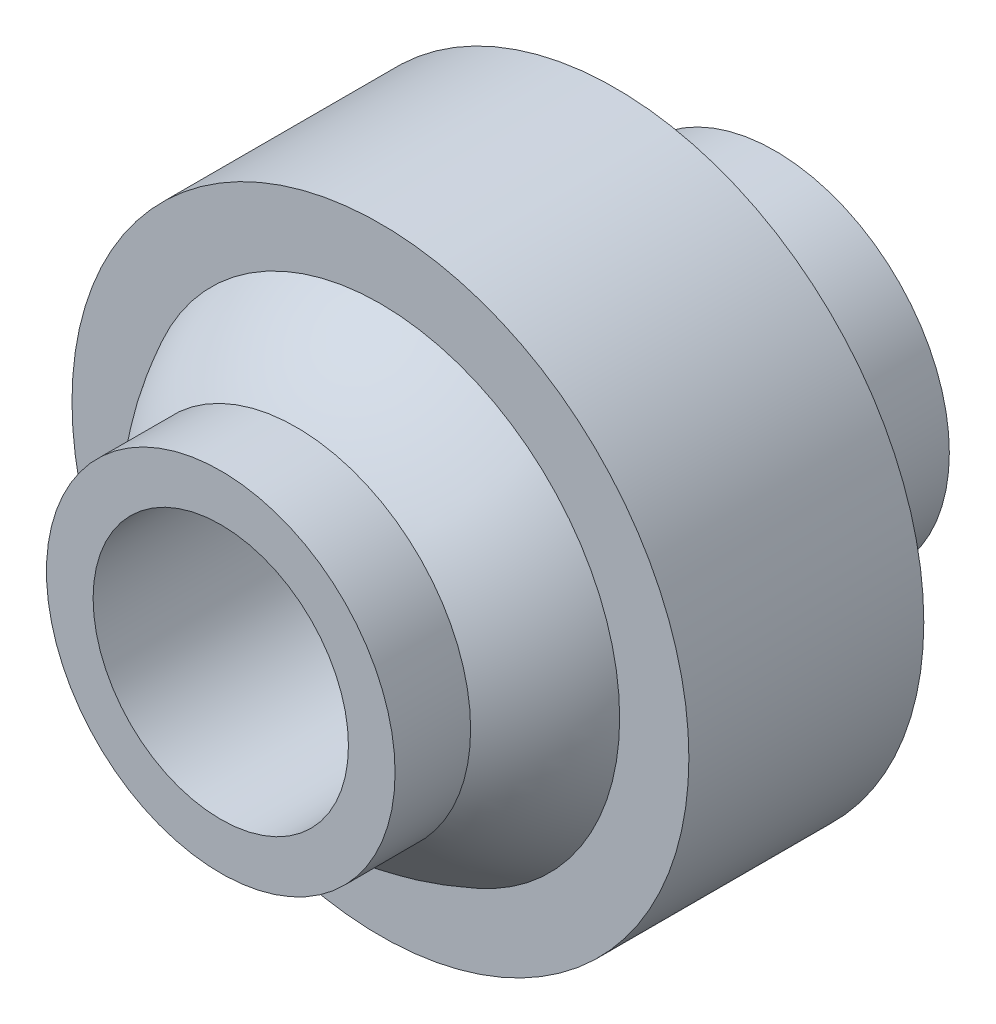
ISO-10303-21;
HEADER;
FILE_DESCRIPTION(('STEP AP214'),'2;1');
FILE_NAME('part.step','',(''),(''),'','','');
FILE_SCHEMA(('AUTOMOTIVE_DESIGN { 1 0 10303 214 1 1 1 1 }'));
ENDSEC;
DATA;
#1=APPLICATION_CONTEXT('core data for automotive mechanical design processes');
#2=APPLICATION_PROTOCOL_DEFINITION('international standard','automotive_design',2000,#1);
#3=PRODUCT_CONTEXT('',#1,'mechanical');
#4=PRODUCT('Part','Part','',(#3));
#5=PRODUCT_RELATED_PRODUCT_CATEGORY('part','',(#4));
#6=PRODUCT_DEFINITION_FORMATION('','',#4);
#7=PRODUCT_DEFINITION_CONTEXT('part definition',#1,'design');
#8=PRODUCT_DEFINITION('design','',#6,#7);
#9=PRODUCT_DEFINITION_SHAPE('','',#8);
#10=(LENGTH_UNIT() NAMED_UNIT(*) SI_UNIT(.MILLI.,.METRE.));
#11=(NAMED_UNIT(*) PLANE_ANGLE_UNIT() SI_UNIT($,.RADIAN.));
#12=(NAMED_UNIT(*) SI_UNIT($,.STERADIAN.) SOLID_ANGLE_UNIT());
#13=UNCERTAINTY_MEASURE_WITH_UNIT(LENGTH_MEASURE(1.E-05),#10,'distance_accuracy_value','');
#14=(GEOMETRIC_REPRESENTATION_CONTEXT(3) GLOBAL_UNCERTAINTY_ASSIGNED_CONTEXT((#13)) GLOBAL_UNIT_ASSIGNED_CONTEXT((#10,
#11,#12)) REPRESENTATION_CONTEXT('',''));
#15=CARTESIAN_POINT('',(0.,0.,0.));
#16=DIRECTION('',(0.,0.,1.));
#17=DIRECTION('',(1.,0.,0.));
#18=AXIS2_PLACEMENT_3D('',#15,#16,#17);
#19=CARTESIAN_POINT('',(0.,-26.811732,-60.7822));
#20=DIRECTION('',(0.,0.,1.));
#21=DIRECTION('',(1.,0.,0.));
#22=AXIS2_PLACEMENT_3D('',#19,#20,#21);
#23=PLANE('',#22);
#24=CARTESIAN_POINT('',(0.,-22.049232,-60.7822));
#25=DIRECTION('',(0.,0.,1.));
#26=DIRECTION('',(1.,0.,0.));
#27=AXIS2_PLACEMENT_3D('',#24,#25,#26);
#28=CIRCLE('',#27,6.5024);
#29=CARTESIAN_POINT('',(6.5024,-22.049232,-60.7822));
#30=VERTEX_POINT('',#29);
#31=EDGE_CURVE('E10',#30,#30,#28,.T.);
#32=ORIENTED_EDGE('',*,*,#31,.T.);
#33=EDGE_LOOP('',(#32));
#34=FACE_BOUND('',#33,.T.);
#35=CARTESIAN_POINT('',(0.,-22.049232,-60.7822));
#36=DIRECTION('',(0.,0.,1.));
#37=DIRECTION('',(1.,0.,0.));
#38=AXIS2_PLACEMENT_3D('',#35,#36,#37);
#39=CIRCLE('',#38,4.7625);
#40=CARTESIAN_POINT('',(4.7625,-22.049232,-60.7822));
#41=VERTEX_POINT('',#40);
#42=EDGE_CURVE('E71',#41,#41,#39,.T.);
#43=ORIENTED_EDGE('',*,*,#42,.F.);
#44=EDGE_LOOP('',(#43));
#45=FACE_BOUND('',#44,.T.);
#46=ADVANCED_FACE('F37',(#34,#45),#23,.T.);
#47=CARTESIAN_POINT('',(0.,-22.049232,-82.1361730867633));
#48=DIRECTION('',(0.,0.,1.));
#49=DIRECTION('',(1.,0.,0.));
#50=AXIS2_PLACEMENT_3D('',#47,#48,#49);
#51=CYLINDRICAL_SURFACE('',#50,6.5024);
#52=CARTESIAN_POINT('',(0.,-22.049232,-63.6000069614774));
#53=DIRECTION('',(0.,0.,1.));
#54=DIRECTION('',(1.,0.,0.));
#55=AXIS2_PLACEMENT_3D('',#52,#53,#54);
#56=CIRCLE('',#55,6.5024);
#57=CARTESIAN_POINT('',(0.,-28.551632,-63.6000069614774));
#58=VERTEX_POINT('',#57);
#59=EDGE_CURVE('E43',#58,#58,#56,.T.);
#60=ORIENTED_EDGE('',*,*,#59,.T.);
#61=EDGE_LOOP('',(#60));
#62=FACE_BOUND('',#61,.T.);
#63=ORIENTED_EDGE('',*,*,#31,.F.);
#64=EDGE_LOOP('',(#63));
#65=FACE_BOUND('',#64,.T.);
#66=ADVANCED_FACE('F79',(#62,#65),#51,.T.);
#67=CARTESIAN_POINT('',(0.,-22.049232,-71.12));
#68=DIRECTION('',(0.,0.,1.));
#69=DIRECTION('',(0.,-1.,0.));
#70=AXIS2_PLACEMENT_3D('',#67,#68,#69);
#71=SPHERICAL_SURFACE('',#70,9.94140337474685);
#72=CARTESIAN_POINT('',(0.,-22.049232,-66.7385));
#73=DIRECTION('',(0.,0.,1.));
#74=DIRECTION('',(1.,0.,0.));
#75=AXIS2_PLACEMENT_3D('',#72,#73,#74);
#76=CIRCLE('',#75,8.92378612526253);
#77=CARTESIAN_POINT('',(0.,-30.9730181252625,-66.7385));
#78=VERTEX_POINT('',#77);
#79=EDGE_CURVE('E47',#78,#78,#76,.T.);
#80=CARTESIAN_POINT('',(0.,-30.9730181252625,-66.7385));
#81=CARTESIAN_POINT('',(0.,-30.9546968172942,-66.7011850210384));
#82=CARTESIAN_POINT('',(0.,-30.9361414336475,-66.6639849715197));
#83=CARTESIAN_POINT('',(0.,-30.8985654926746,-66.5898205560576));
#84=CARTESIAN_POINT('',(0.,-30.8795449353484,-66.5528561901143));
#85=CARTESIAN_POINT('',(0.,-30.8410416246939,-66.4791689664927));
#86=CARTESIAN_POINT('',(0.,-30.8215588713656,-66.4424461088144));
#87=CARTESIAN_POINT('',(0.,-30.7821342387314,-66.3692476784703));
#88=CARTESIAN_POINT('',(0.,-30.7621923594254,-66.3327721058044));
#89=CARTESIAN_POINT('',(0.,-30.7218526118547,-66.2600739859813));
#90=CARTESIAN_POINT('',(0.,-30.7014547435899,-66.2238514388242));
#91=CARTESIAN_POINT('',(0.,-30.6602062282843,-66.1516650699845));
#92=CARTESIAN_POINT('',(0.,-30.6393555812437,-66.115701248302));
#93=CARTESIAN_POINT('',(0.,-30.5972047894432,-66.0440379898545));
#94=CARTESIAN_POINT('',(0.,-30.5759046446834,-66.0083385530896));
#95=CARTESIAN_POINT('',(0.,-30.5328582093371,-65.9372096822646));
#96=CARTESIAN_POINT('',(0.,-30.5111119187507,-65.9017802482044));
#97=CARTESIAN_POINT('',(0.,-30.4671766138237,-65.8311969581013));
#98=CARTESIAN_POINT('',(0.,-30.4449875994832,-65.7960431020582));
#99=CARTESIAN_POINT('',(0.,-30.4001703387966,-65.7260164999317));
#100=CARTESIAN_POINT('',(0.,-30.3775420924505,-65.6911437538483));
#101=CARTESIAN_POINT('',(0.,-30.3318499286185,-65.6216848593482));
#102=CARTESIAN_POINT('',(0.,-30.3087860111326,-65.5870987109315));
#103=CARTESIAN_POINT('',(0.,-30.2622261344462,-65.5182184543714));
#104=CARTESIAN_POINT('',(0.,-30.2387301752457,-65.4839243462281));
#105=CARTESIAN_POINT('',(0.,-30.1913099125428,-65.4156335668651));
#106=CARTESIAN_POINT('',(0.,-30.1673856090403,-65.3816368956454));
#107=CARTESIAN_POINT('',(0.,-30.1191124225522,-65.3139463399739));
#108=CARTESIAN_POINT('',(0.,-30.0947635395665,-65.2802524555222));
#109=CARTESIAN_POINT('',(0.,-30.0456450257438,-65.2131727755835));
#110=CARTESIAN_POINT('',(0.,-30.0208753949069,-65.1797869800965));
#111=CARTESIAN_POINT('',(0.,-29.9709192832243,-65.1133287318019));
#112=CARTESIAN_POINT('',(0.,-29.9457328023786,-65.0802562789943));
#113=CARTESIAN_POINT('',(0.,-29.8949469541182,-65.0144299204645));
#114=CARTESIAN_POINT('',(0.,-29.8693475867035,-64.9816760147422));
#115=CARTESIAN_POINT('',(0.,-29.8177399937179,-64.9164919046612));
#116=CARTESIAN_POINT('',(0.,-29.7917317681471,-64.8840617003024));
#117=CARTESIAN_POINT('',(0.,-29.7393105516018,-64.8195300962874));
#118=CARTESIAN_POINT('',(0.,-29.7128975606273,-64.7874286966313));
#119=CARTESIAN_POINT('',(0.,-29.6596709697226,-64.7235597536191));
#120=CARTESIAN_POINT('',(0.,-29.6328573697924,-64.6917922102631));
#121=CARTESIAN_POINT('',(0.,-29.5788337804654,-64.6285959789114));
#122=CARTESIAN_POINT('',(0.,-29.5516237910686,-64.5971672909158));
#123=CARTESIAN_POINT('',(0.,-29.4968117046751,-64.5346537160218));
#124=CARTESIAN_POINT('',(0.,-29.4692096076784,-64.5035688291235));
#125=CARTESIAN_POINT('',(0.,-29.4136176496549,-64.4417477480594));
#126=CARTESIAN_POINT('',(0.,-29.3856277886281,-64.4110115538935));
#127=CARTESIAN_POINT('',(0.,-29.3292647071351,-64.3498926950573));
#128=CARTESIAN_POINT('',(0.,-29.3008914866688,-64.319510030387));
#129=CARTESIAN_POINT('',(0.,-29.2437661512124,-64.2591030116738));
#130=CARTESIAN_POINT('',(0.,-29.2150140362224,-64.229078657631));
#131=CARTESIAN_POINT('',(0.,-29.157135436264,-64.1693929849136));
#132=CARTESIAN_POINT('',(0.,-29.1280089512957,-64.139731666239));
#133=CARTESIAN_POINT('',(0.,-29.0693861948185,-64.0807767318931));
#134=CARTESIAN_POINT('',(0.,-29.0398899233096,-64.0514831162218));
#135=CARTESIAN_POINT('',(0.,-28.980532235455,-63.9932681975692));
#136=CARTESIAN_POINT('',(0.,-28.9506708191094,-63.964346894588));
#137=CARTESIAN_POINT('',(0.,-28.890587540465,-63.9068811527306));
#138=CARTESIAN_POINT('',(0.,-28.8603656781663,-63.8783367138544));
#139=CARTESIAN_POINT('',(0.,-28.7995662642682,-63.8216291911362));
#140=CARTESIAN_POINT('',(0.,-28.7689887126688,-63.7934661072941));
#141=CARTESIAN_POINT('',(0.,-28.7074827288851,-63.7375257299696));
#142=CARTESIAN_POINT('',(0.,-28.6765542967007,-63.7097484364872));
#143=CARTESIAN_POINT('',(0.,-28.6143514302681,-63.6545839980472));
#144=CARTESIAN_POINT('',(0.,-28.5830769960198,-63.6271968530898));
#145=CARTESIAN_POINT('',(0.,-28.551632,-63.6000069614774));
#146=B_SPLINE_CURVE_WITH_KNOTS('',3,(#80,#81,#82,#83,#84,#85,#86,#87,#88,#89,#90,#91,#92,#93,
#94,#95,#96,#97,#98,#99,#100,#101,#102,#103,#104,#105,#106,#107,#108,#109,#110,#111,#112,#113,
#114,#115,#116,#117,#118,#119,#120,#121,#122,#123,#124,#125,#126,#127,#128,#129,#130,#131,#132,
#133,#134,#135,#136,#137,#138,#139,#140,#141,#142,#143,#144,#145),.UNSPECIFIED.,.F.,.F.,(4,2,2,
2,2,2,2,2,2,2,2,2,2,2,2,2,2,2,2,2,2,2,2,2,2,2,2,2,2,2,2,2,4),(0.,0.124709653743761,
0.249419307487528,0.374128961231285,0.49883861497504,0.62354826871879,0.748257922462551,
0.872967576206311,0.997677229950065,1.12238688369382,1.24709653743757,1.37180619118134,
1.49651584492509,1.62122549866885,1.74593515241261,1.87064480615637,1.99535445990012,
2.12006411364388,2.24477376738763,2.3694834211314,2.49419307487515,2.61890272861891,
2.74361238236267,2.86832203610643,2.99303168985017,3.11774134359393,3.24245099733769,
3.36716065108145,3.4918703048252,3.61657995856896,3.74128961231272,3.86599926605648,
3.99070891980024),.UNSPECIFIED.);
#147=EDGE_CURVE('BSEAM83',#78,#58,#146,.T.);
#148=ORIENTED_EDGE('',*,*,#79,.T.);
#149=ORIENTED_EDGE('',*,*,#59,.F.);
#150=ORIENTED_EDGE('',*,*,#147,.T.);
#151=ORIENTED_EDGE('',*,*,#147,.F.);
#152=EDGE_LOOP('',(#148,#150,#149,#151));
#153=FACE_BOUND('',#152,.T.);
#154=ADVANCED_FACE('F83',(#153),#71,.T.);
#155=CARTESIAN_POINT('',(0.,-30.9730181252625,-66.7385));
#156=DIRECTION('',(0.,0.,1.));
#157=DIRECTION('',(1.,0.,0.));
#158=AXIS2_PLACEMENT_3D('',#155,#156,#157);
#159=PLANE('',#158);
#160=CARTESIAN_POINT('',(0.,-22.049232,-66.7385));
#161=DIRECTION('',(0.,0.,1.));
#162=DIRECTION('',(1.,0.,0.));
#163=AXIS2_PLACEMENT_3D('',#160,#161,#162);
#164=CIRCLE('',#163,11.5062);
#165=CARTESIAN_POINT('',(11.5062,-22.049232,-66.7385));
#166=VERTEX_POINT('',#165);
#167=EDGE_CURVE('E51',#166,#166,#164,.T.);
#168=ORIENTED_EDGE('',*,*,#167,.T.);
#169=EDGE_LOOP('',(#168));
#170=FACE_BOUND('',#169,.T.);
#171=ORIENTED_EDGE('',*,*,#79,.F.);
#172=EDGE_LOOP('',(#171));
#173=FACE_BOUND('',#172,.T.);
#174=ADVANCED_FACE('F87',(#170,#173),#159,.T.);
#175=CARTESIAN_POINT('',(0.,-22.049232,-82.1361730867633));
#176=DIRECTION('',(0.,0.,1.));
#177=DIRECTION('',(1.,0.,0.));
#178=AXIS2_PLACEMENT_3D('',#175,#176,#177);
#179=CYLINDRICAL_SURFACE('',#178,11.5062);
#180=CARTESIAN_POINT('',(0.,-22.049232,-75.5015));
#181=DIRECTION('',(0.,0.,1.));
#182=DIRECTION('',(1.,0.,0.));
#183=AXIS2_PLACEMENT_3D('',#180,#181,#182);
#184=CIRCLE('',#183,11.5062);
#185=CARTESIAN_POINT('',(11.5062,-22.049232,-75.5015));
#186=VERTEX_POINT('',#185);
#187=EDGE_CURVE('E56',#186,#186,#184,.T.);
#188=ORIENTED_EDGE('',*,*,#187,.T.);
#189=EDGE_LOOP('',(#188));
#190=FACE_BOUND('',#189,.T.);
#191=ORIENTED_EDGE('',*,*,#167,.F.);
#192=EDGE_LOOP('',(#191));
#193=FACE_BOUND('',#192,.T.);
#194=ADVANCED_FACE('F94',(#190,#193),#179,.T.);
#195=CARTESIAN_POINT('',(0.,-33.555432,-75.5015));
#196=DIRECTION('',(0.,0.,-1.));
#197=DIRECTION('',(-1.,0.,0.));
#198=AXIS2_PLACEMENT_3D('',#195,#196,#197);
#199=PLANE('',#198);
#200=CARTESIAN_POINT('',(0.,-22.049232,-75.5015));
#201=DIRECTION('',(0.,0.,1.));
#202=DIRECTION('',(1.,0.,0.));
#203=AXIS2_PLACEMENT_3D('',#200,#201,#202);
#204=CIRCLE('',#203,8.92378612526253);
#205=CARTESIAN_POINT('',(0.,-30.9730181252625,-75.5015));
#206=VERTEX_POINT('',#205);
#207=EDGE_CURVE('E59',#206,#206,#204,.T.);
#208=ORIENTED_EDGE('',*,*,#207,.T.);
#209=EDGE_LOOP('',(#208));
#210=FACE_BOUND('',#209,.T.);
#211=ORIENTED_EDGE('',*,*,#187,.F.);
#212=EDGE_LOOP('',(#211));
#213=FACE_BOUND('',#212,.T.);
#214=ADVANCED_FACE('F98',(#210,#213),#199,.T.);
#215=CARTESIAN_POINT('',(0.,-22.049232,-71.12));
#216=DIRECTION('',(0.,0.,1.));
#217=DIRECTION('',(0.,-1.,0.));
#218=AXIS2_PLACEMENT_3D('',#215,#216,#217);
#219=SPHERICAL_SURFACE('',#218,9.94140337474685);
#220=CARTESIAN_POINT('',(0.,-22.049232,-78.6399930385226));
#221=DIRECTION('',(0.,0.,1.));
#222=DIRECTION('',(1.,0.,0.));
#223=AXIS2_PLACEMENT_3D('',#220,#221,#222);
#224=CIRCLE('',#223,6.5024);
#225=CARTESIAN_POINT('',(0.,-28.551632,-78.6399930385226));
#226=VERTEX_POINT('',#225);
#227=EDGE_CURVE('E62',#226,#226,#224,.T.);
#228=CARTESIAN_POINT('',(0.,-28.551632,-78.6399930385226));
#229=CARTESIAN_POINT('',(0.,-28.5830769960198,-78.6128031469102));
#230=CARTESIAN_POINT('',(0.,-28.6143514302681,-78.5854160019528));
#231=CARTESIAN_POINT('',(0.,-28.6765542967007,-78.5302515635128));
#232=CARTESIAN_POINT('',(0.,-28.707482728885,-78.5024742700304));
#233=CARTESIAN_POINT('',(0.,-28.7689887126688,-78.4465338927059));
#234=CARTESIAN_POINT('',(0.,-28.7995662642682,-78.4183708088638));
#235=CARTESIAN_POINT('',(0.,-28.8603656781663,-78.3616632861455));
#236=CARTESIAN_POINT('',(0.,-28.890587540465,-78.3331188472694));
#237=CARTESIAN_POINT('',(0.,-28.9506708191094,-78.275653105412));
#238=CARTESIAN_POINT('',(0.,-28.980532235455,-78.2467318024308));
#239=CARTESIAN_POINT('',(0.,-29.0398899233096,-78.1885168837782));
#240=CARTESIAN_POINT('',(0.,-29.0693861948185,-78.1592232681069));
#241=CARTESIAN_POINT('',(0.,-29.1280089512957,-78.100268333761));
#242=CARTESIAN_POINT('',(0.,-29.157135436264,-78.0706070150864));
#243=CARTESIAN_POINT('',(0.,-29.2150140362223,-78.010921342369));
#244=CARTESIAN_POINT('',(0.,-29.2437661512124,-77.9808969883262));
#245=CARTESIAN_POINT('',(0.,-29.3008914866688,-77.920489969613));
#246=CARTESIAN_POINT('',(0.,-29.3292647071351,-77.8901073049427));
#247=CARTESIAN_POINT('',(0.,-29.3856277886281,-77.8289884461065));
#248=CARTESIAN_POINT('',(0.,-29.4136176496549,-77.7982522519406));
#249=CARTESIAN_POINT('',(0.,-29.4692096076783,-77.7364311708765));
#250=CARTESIAN_POINT('',(0.,-29.4968117046751,-77.7053462839782));
#251=CARTESIAN_POINT('',(0.,-29.5516237910686,-77.6428327090842));
#252=CARTESIAN_POINT('',(0.,-29.5788337804654,-77.6114040210886));
#253=CARTESIAN_POINT('',(0.,-29.6328573697924,-77.5482077897369));
#254=CARTESIAN_POINT('',(0.,-29.6596709697226,-77.5164402463809));
#255=CARTESIAN_POINT('',(0.,-29.7128975606273,-77.4525713033687));
#256=CARTESIAN_POINT('',(0.,-29.7393105516017,-77.4204699037126));
#257=CARTESIAN_POINT('',(0.,-29.791731768147,-77.3559382996976));
#258=CARTESIAN_POINT('',(0.,-29.8177399937179,-77.3235080953388));
#259=CARTESIAN_POINT('',(0.,-29.8693475867035,-77.2583239852578));
#260=CARTESIAN_POINT('',(0.,-29.8949469541182,-77.2255700795355));
#261=CARTESIAN_POINT('',(0.,-29.9457328023786,-77.1597437210056));
#262=CARTESIAN_POINT('',(0.,-29.9709192832243,-77.1266712681981));
#263=CARTESIAN_POINT('',(0.,-30.0208753949069,-77.0602130199035));
#264=CARTESIAN_POINT('',(0.,-30.0456450257438,-77.0268272244165));
#265=CARTESIAN_POINT('',(0.,-30.0947635395665,-76.9597475444778));
#266=CARTESIAN_POINT('',(0.,-30.1191124225522,-76.9260536600261));
#267=CARTESIAN_POINT('',(0.,-30.1673856090403,-76.8583631043546));
#268=CARTESIAN_POINT('',(0.,-30.1913099125428,-76.8243664331349));
#269=CARTESIAN_POINT('',(0.,-30.2387301752457,-76.7560756537719));
#270=CARTESIAN_POINT('',(0.,-30.2622261344462,-76.7217815456286));
#271=CARTESIAN_POINT('',(0.,-30.3087860111326,-76.6529012890685));
#272=CARTESIAN_POINT('',(0.,-30.3318499286185,-76.6183151406518));
#273=CARTESIAN_POINT('',(0.,-30.3775420924505,-76.5488562461517));
#274=CARTESIAN_POINT('',(0.,-30.4001703387966,-76.5139835000683));
#275=CARTESIAN_POINT('',(0.,-30.4449875994832,-76.4439568979418));
#276=CARTESIAN_POINT('',(0.,-30.4671766138237,-76.4088030418987));
#277=CARTESIAN_POINT('',(0.,-30.5111119187507,-76.3382197517955));
#278=CARTESIAN_POINT('',(0.,-30.5328582093371,-76.3027903177354));
#279=CARTESIAN_POINT('',(0.,-30.5759046446834,-76.2316614469104));
#280=CARTESIAN_POINT('',(0.,-30.5972047894432,-76.1959620101455));
#281=CARTESIAN_POINT('',(0.,-30.6393555812437,-76.124298751698));
#282=CARTESIAN_POINT('',(0.,-30.6602062282843,-76.0883349300155));
#283=CARTESIAN_POINT('',(0.,-30.7014547435898,-76.0161485611758));
#284=CARTESIAN_POINT('',(0.,-30.7218526118547,-75.9799260140186));
#285=CARTESIAN_POINT('',(0.,-30.7621923594254,-75.9072278941956));
#286=CARTESIAN_POINT('',(0.,-30.7821342387314,-75.8707523215297));
#287=CARTESIAN_POINT('',(0.,-30.8215588713656,-75.7975538911856));
#288=CARTESIAN_POINT('',(0.,-30.8410416246939,-75.7608310335073));
#289=CARTESIAN_POINT('',(0.,-30.8795449353484,-75.6871438098857));
#290=CARTESIAN_POINT('',(0.,-30.8985654926746,-75.6501794439424));
#291=CARTESIAN_POINT('',(0.,-30.9361414336475,-75.5760150284803));
#292=CARTESIAN_POINT('',(0.,-30.9546968172942,-75.5388149789616));
#293=CARTESIAN_POINT('',(0.,-30.9730181252625,-75.5015));
#294=B_SPLINE_CURVE_WITH_KNOTS('',3,(#228,#229,#230,#231,#232,#233,#234,#235,#236,#237,#238,
#239,#240,#241,#242,#243,#244,#245,#246,#247,#248,#249,#250,#251,#252,#253,#254,#255,#256,#257,
#258,#259,#260,#261,#262,#263,#264,#265,#266,#267,#268,#269,#270,#271,#272,#273,#274,#275,#276,
#277,#278,#279,#280,#281,#282,#283,#284,#285,#286,#287,#288,#289,#290,#291,#292,#293),
.UNSPECIFIED.,.F.,.F.,(4,2,2,2,2,2,2,2,2,2,2,2,2,2,2,2,2,2,2,2,2,2,2,2,2,2,2,2,2,2,2,2,4),(0.,
0.124709653743763,0.249419307487516,0.374128961231278,0.498838614975035,0.623548268718788,
0.748257922462548,0.872967576206305,0.997677229950066,1.12238688369382,1.24709653743757,
1.37180619118134,1.49651584492509,1.62122549866884,1.74593515241261,1.87064480615636,
1.99535445990012,2.12006411364387,2.24477376738764,2.3694834211314,2.49419307487515,
2.61890272861891,2.74361238236267,2.86832203610642,2.99303168985018,3.11774134359393,
3.24245099733769,3.36716065108146,3.49187030482521,3.61657995856897,3.74128961231272,
3.86599926605648,3.99070891980023),.UNSPECIFIED.);
#295=EDGE_CURVE('BSEAM102',#226,#206,#294,.T.);
#296=ORIENTED_EDGE('',*,*,#227,.T.);
#297=ORIENTED_EDGE('',*,*,#207,.F.);
#298=ORIENTED_EDGE('',*,*,#295,.T.);
#299=ORIENTED_EDGE('',*,*,#295,.F.);
#300=EDGE_LOOP('',(#296,#298,#297,#299));
#301=FACE_BOUND('',#300,.T.);
#302=ADVANCED_FACE('F102',(#301),#219,.T.);
#303=CARTESIAN_POINT('',(0.,-22.049232,-82.1361730867633));
#304=DIRECTION('',(0.,0.,1.));
#305=DIRECTION('',(1.,0.,0.));
#306=AXIS2_PLACEMENT_3D('',#303,#304,#305);
#307=CYLINDRICAL_SURFACE('',#306,6.5024);
#308=CARTESIAN_POINT('',(0.,-22.049232,-81.4578));
#309=DIRECTION('',(0.,0.,1.));
#310=DIRECTION('',(1.,0.,0.));
#311=AXIS2_PLACEMENT_3D('',#308,#309,#310);
#312=CIRCLE('',#311,6.5024);
#313=CARTESIAN_POINT('',(6.5024,-22.049232,-81.4578));
#314=VERTEX_POINT('',#313);
#315=EDGE_CURVE('E65',#314,#314,#312,.T.);
#316=ORIENTED_EDGE('',*,*,#315,.T.);
#317=EDGE_LOOP('',(#316));
#318=FACE_BOUND('',#317,.T.);
#319=ORIENTED_EDGE('',*,*,#227,.F.);
#320=EDGE_LOOP('',(#319));
#321=FACE_BOUND('',#320,.T.);
#322=ADVANCED_FACE('F106',(#318,#321),#307,.T.);
#323=CARTESIAN_POINT('',(0.,-26.811732,-81.4578));
#324=DIRECTION('',(0.,0.,-1.));
#325=DIRECTION('',(-1.,0.,0.));
#326=AXIS2_PLACEMENT_3D('',#323,#324,#325);
#327=PLANE('',#326);
#328=CARTESIAN_POINT('',(0.,-22.049232,-81.4578));
#329=DIRECTION('',(0.,0.,1.));
#330=DIRECTION('',(1.,0.,0.));
#331=AXIS2_PLACEMENT_3D('',#328,#329,#330);
#332=CIRCLE('',#331,4.7625);
#333=CARTESIAN_POINT('',(4.7625,-22.049232,-81.4578));
#334=VERTEX_POINT('',#333);
#335=EDGE_CURVE('E68',#334,#334,#332,.T.);
#336=ORIENTED_EDGE('',*,*,#335,.T.);
#337=EDGE_LOOP('',(#336));
#338=FACE_BOUND('',#337,.T.);
#339=ORIENTED_EDGE('',*,*,#315,.F.);
#340=EDGE_LOOP('',(#339));
#341=FACE_BOUND('',#340,.T.);
#342=ADVANCED_FACE('F110',(#338,#341),#327,.T.);
#343=CARTESIAN_POINT('',(0.,-22.049232,-82.1361730867633));
#344=DIRECTION('',(0.,0.,1.));
#345=DIRECTION('',(1.,0.,0.));
#346=AXIS2_PLACEMENT_3D('',#343,#344,#345);
#347=CYLINDRICAL_SURFACE('',#346,4.7625);
#348=ORIENTED_EDGE('',*,*,#42,.T.);
#349=EDGE_LOOP('',(#348));
#350=FACE_BOUND('',#349,.T.);
#351=ORIENTED_EDGE('',*,*,#335,.F.);
#352=EDGE_LOOP('',(#351));
#353=FACE_BOUND('',#352,.T.);
#354=ADVANCED_FACE('F75',(#350,#353),#347,.F.);
#355=CLOSED_SHELL('',(#46,#66,#154,#174,#194,#214,#302,#322,#342,#354));
#356=MANIFOLD_SOLID_BREP('B2',#355);
#357=ADVANCED_BREP_SHAPE_REPRESENTATION('',(#18,#356),#14);
#358=SHAPE_DEFINITION_REPRESENTATION(#9,#357);
ENDSEC;
END-ISO-10303-21;
